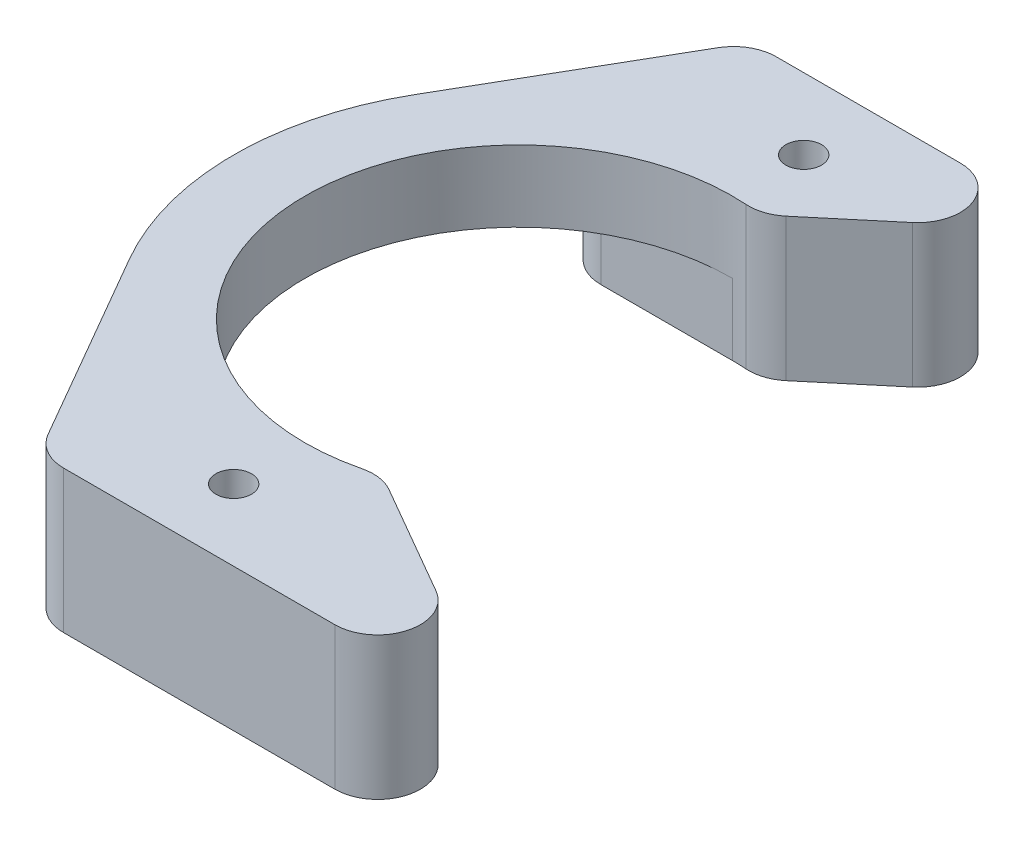
ISO-10303-21;
HEADER;
FILE_DESCRIPTION(('STEP AP214'),'2;1');
FILE_NAME('part.step','',(''),(''),'','','');
FILE_SCHEMA(('AUTOMOTIVE_DESIGN { 1 0 10303 214 1 1 1 1 }'));
ENDSEC;
DATA;
#1=APPLICATION_CONTEXT('core data for automotive mechanical design processes');
#2=APPLICATION_PROTOCOL_DEFINITION('international standard','automotive_design',2000,#1);
#3=PRODUCT_CONTEXT('',#1,'mechanical');
#4=PRODUCT('Part','Part','',(#3));
#5=PRODUCT_RELATED_PRODUCT_CATEGORY('part','',(#4));
#6=PRODUCT_DEFINITION_FORMATION('','',#4);
#7=PRODUCT_DEFINITION_CONTEXT('part definition',#1,'design');
#8=PRODUCT_DEFINITION('design','',#6,#7);
#9=PRODUCT_DEFINITION_SHAPE('','',#8);
#10=(LENGTH_UNIT() NAMED_UNIT(*) SI_UNIT(.MILLI.,.METRE.));
#11=(NAMED_UNIT(*) PLANE_ANGLE_UNIT() SI_UNIT($,.RADIAN.));
#12=(NAMED_UNIT(*) SI_UNIT($,.STERADIAN.) SOLID_ANGLE_UNIT());
#13=UNCERTAINTY_MEASURE_WITH_UNIT(LENGTH_MEASURE(1.E-05),#10,'distance_accuracy_value','');
#14=(GEOMETRIC_REPRESENTATION_CONTEXT(3) GLOBAL_UNCERTAINTY_ASSIGNED_CONTEXT((#13)) GLOBAL_UNIT_ASSIGNED_CONTEXT((#10,
#11,#12)) REPRESENTATION_CONTEXT('',''));
#15=CARTESIAN_POINT('',(0.,0.,0.));
#16=DIRECTION('',(0.,0.,1.));
#17=DIRECTION('',(1.,0.,0.));
#18=AXIS2_PLACEMENT_3D('',#15,#16,#17);
#19=CARTESIAN_POINT('',(-17.3205080756887,10.,-10.0000000000001));
#20=DIRECTION('',(0.866025403784436,0.,0.500000000000005));
#21=DIRECTION('',(0.500000000000005,0.,-0.866025403784436));
#22=AXIS2_PLACEMENT_3D('',#19,#20,#21);
#23=PLANE('',#22);
#24=DIRECTION('',(-0.500000000000005,0.,0.866025403784436));
#25=VECTOR('',#24,1.);
#26=CARTESIAN_POINT('',(-17.3205080756887,0.,-10.0000000000001));
#27=LINE('',#26,#25);
#28=CARTESIAN_POINT('',(-9.52627944162872,0.,-23.5));
#29=VERTEX_POINT('',#28);
#30=CARTESIAN_POINT('',(-11.8356805183873,0.,-19.5));
#31=VERTEX_POINT('',#30);
#32=EDGE_CURVE('E231',#29,#31,#27,.T.);
#33=ORIENTED_EDGE('',*,*,#32,.T.);
#34=DIRECTION('',(0.,-1.,0.));
#35=VECTOR('',#34,1.);
#36=CARTESIAN_POINT('',(-11.8356805183873,10.,-19.5));
#37=LINE('',#36,#35);
#38=CARTESIAN_POINT('',(-11.8356805183873,5.,-19.5));
#39=VERTEX_POINT('',#38);
#40=EDGE_CURVE('E290',#31,#39,#37,.F.);
#41=ORIENTED_EDGE('',*,*,#40,.T.);
#42=DIRECTION('',(0.500000000000004,0.,-0.866025403784436));
#43=VECTOR('',#42,1.);
#44=CARTESIAN_POINT('',(-14.4337567297406,5.,-15.));
#45=LINE('',#44,#43);
#46=CARTESIAN_POINT('',(-17.3205080756887,5.,-10.0000000000001));
#47=VERTEX_POINT('',#46);
#48=EDGE_CURVE('E216',#47,#39,#45,.T.);
#49=ORIENTED_EDGE('',*,*,#48,.F.);
#50=DIRECTION('',(0.,-1.,0.));
#51=VECTOR('',#50,1.);
#52=CARTESIAN_POINT('',(-17.3205080756887,10.,-10.0000000000001));
#53=LINE('',#52,#51);
#54=CARTESIAN_POINT('',(-17.3205080756887,10.,-10.0000000000001));
#55=VERTEX_POINT('',#54);
#56=EDGE_CURVE('E192',#55,#47,#53,.T.);
#57=ORIENTED_EDGE('',*,*,#56,.F.);
#58=DIRECTION('',(-0.500000000000005,0.,0.866025403784436));
#59=VECTOR('',#58,1.);
#60=CARTESIAN_POINT('',(-17.3205080756887,10.,-10.0000000000001));
#61=LINE('',#60,#59);
#62=CARTESIAN_POINT('',(-9.52627944162872,10.,-23.5));
#63=VERTEX_POINT('',#62);
#64=EDGE_CURVE('E235',#63,#55,#61,.T.);
#65=ORIENTED_EDGE('',*,*,#64,.F.);
#66=DIRECTION('',(0.,-1.,0.));
#67=VECTOR('',#66,1.);
#68=CARTESIAN_POINT('',(-9.52627944162873,10.,-23.5));
#69=LINE('',#68,#67);
#70=EDGE_CURVE('E284',#63,#29,#69,.T.);
#71=ORIENTED_EDGE('',*,*,#70,.T.);
#72=EDGE_LOOP('',(#33,#41,#49,#57,#65,#71));
#73=FACE_BOUND('',#72,.T.);
#74=ADVANCED_FACE('F43',(#73),#23,.F.);
#75=CARTESIAN_POINT('',(0.,10.,0.));
#76=DIRECTION('',(0.,-1.,0.));
#77=DIRECTION('',(0.,0.,-1.));
#78=AXIS2_PLACEMENT_3D('',#75,#76,#77);
#79=CYLINDRICAL_SURFACE('',#78,20.);
#80=CARTESIAN_POINT('',(0.,5.,0.));
#81=DIRECTION('',(0.,-1.,0.));
#82=DIRECTION('',(0.,0.,-1.));
#83=AXIS2_PLACEMENT_3D('',#80,#81,#82);
#84=CIRCLE('',#83,20.);
#85=CARTESIAN_POINT('',(-17.3205080756887,5.,10.0000000000001));
#86=VERTEX_POINT('',#85);
#87=EDGE_CURVE('E386',#86,#47,#84,.T.);
#88=ORIENTED_EDGE('',*,*,#87,.F.);
#89=DIRECTION('',(0.,-1.,0.));
#90=VECTOR('',#89,1.);
#91=CARTESIAN_POINT('',(-17.3205080756887,10.,10.0000000000001));
#92=LINE('',#91,#90);
#93=CARTESIAN_POINT('',(-17.3205080756887,10.,10.0000000000001));
#94=VERTEX_POINT('',#93);
#95=EDGE_CURVE('E252',#94,#86,#92,.T.);
#96=ORIENTED_EDGE('',*,*,#95,.F.);
#97=CARTESIAN_POINT('',(0.,10.,0.));
#98=DIRECTION('',(0.,1.,0.));
#99=DIRECTION('',(0.,0.,1.));
#100=AXIS2_PLACEMENT_3D('',#97,#98,#99);
#101=CIRCLE('',#100,20.);
#102=EDGE_CURVE('E232',#55,#94,#101,.T.);
#103=ORIENTED_EDGE('',*,*,#102,.F.);
#104=ORIENTED_EDGE('',*,*,#56,.T.);
#105=EDGE_LOOP('',(#88,#96,#103,#104));
#106=FACE_BOUND('',#105,.T.);
#107=ADVANCED_FACE('F396',(#106),#79,.T.);
#108=CARTESIAN_POINT('',(0.,10.,0.));
#109=DIRECTION('',(0.,-1.,0.));
#110=DIRECTION('',(0.,0.,-1.));
#111=AXIS2_PLACEMENT_3D('',#108,#109,#110);
#112=CYLINDRICAL_SURFACE('',#111,15.);
#113=CARTESIAN_POINT('',(0.,10.,0.));
#114=DIRECTION('',(0.,1.,0.));
#115=DIRECTION('',(0.,0.,1.));
#116=AXIS2_PLACEMENT_3D('',#113,#114,#115);
#117=CIRCLE('',#116,15.);
#118=CARTESIAN_POINT('',(0.98411456541952,10.,-14.9676824699794));
#119=VERTEX_POINT('',#118);
#120=CARTESIAN_POINT('',(3.56827443868658,10.,14.5694000401601));
#121=VERTEX_POINT('',#120);
#122=EDGE_CURVE('E246',#119,#121,#117,.T.);
#123=ORIENTED_EDGE('',*,*,#122,.T.);
#124=DIRECTION('',(0.,-1.,0.));
#125=VECTOR('',#124,1.);
#126=CARTESIAN_POINT('',(3.56827443868658,10.,14.5694000401601));
#127=LINE('',#126,#125);
#128=CARTESIAN_POINT('',(3.56827443868658,0.,14.5694000401601));
#129=VERTEX_POINT('',#128);
#130=EDGE_CURVE('E308',#121,#129,#127,.T.);
#131=ORIENTED_EDGE('',*,*,#130,.T.);
#132=CARTESIAN_POINT('',(0.,0.,0.));
#133=DIRECTION('',(0.,1.,0.));
#134=DIRECTION('',(0.,0.,1.));
#135=AXIS2_PLACEMENT_3D('',#132,#133,#134);
#136=CIRCLE('',#135,15.);
#137=CARTESIAN_POINT('',(0.,0.,15.));
#138=VERTEX_POINT('',#137);
#139=EDGE_CURVE('E211',#138,#129,#136,.T.);
#140=ORIENTED_EDGE('',*,*,#139,.F.);
#141=DIRECTION('',(0.,-1.,0.));
#142=VECTOR('',#141,1.);
#143=CARTESIAN_POINT('',(0.,5.,15.));
#144=LINE('',#143,#142);
#145=CARTESIAN_POINT('',(0.,5.,15.));
#146=VERTEX_POINT('',#145);
#147=EDGE_CURVE('E200',#146,#138,#144,.T.);
#148=ORIENTED_EDGE('',*,*,#147,.F.);
#149=CARTESIAN_POINT('',(0.,5.,0.));
#150=DIRECTION('',(0.,-1.,0.));
#151=DIRECTION('',(0.,0.,-1.));
#152=AXIS2_PLACEMENT_3D('',#149,#150,#151);
#153=CIRCLE('',#152,15.);
#154=CARTESIAN_POINT('',(0.,5.,-15.));
#155=VERTEX_POINT('',#154);
#156=EDGE_CURVE('E185',#146,#155,#153,.T.);
#157=ORIENTED_EDGE('',*,*,#156,.T.);
#158=DIRECTION('',(0.,-1.,0.));
#159=VECTOR('',#158,1.);
#160=CARTESIAN_POINT('',(1.57116660247941E-13,5.,-15.));
#161=LINE('',#160,#159);
#162=CARTESIAN_POINT('',(1.57116660247941E-13,0.,-15.));
#163=VERTEX_POINT('',#162);
#164=EDGE_CURVE('E215',#155,#163,#161,.T.);
#165=ORIENTED_EDGE('',*,*,#164,.T.);
#166=CARTESIAN_POINT('',(0.98411456541952,0.,-14.9676824699794));
#167=VERTEX_POINT('',#166);
#168=EDGE_CURVE('E262',#167,#163,#136,.T.);
#169=ORIENTED_EDGE('',*,*,#168,.F.);
#170=DIRECTION('',(0.,-1.,0.));
#171=VECTOR('',#170,1.);
#172=CARTESIAN_POINT('',(0.98411456541952,10.,-14.9676824699794));
#173=LINE('',#172,#171);
#174=EDGE_CURVE('E302',#167,#119,#173,.F.);
#175=ORIENTED_EDGE('',*,*,#174,.T.);
#176=EDGE_LOOP('',(#123,#131,#140,#148,#157,#165,#169,#175));
#177=FACE_BOUND('',#176,.T.);
#178=ADVANCED_FACE('F208',(#177),#112,.F.);
#179=CARTESIAN_POINT('',(0.,0.,0.));
#180=DIRECTION('',(0.,1.,0.));
#181=DIRECTION('',(0.,0.,1.));
#182=AXIS2_PLACEMENT_3D('',#179,#180,#181);
#183=PLANE('',#182);
#184=CARTESIAN_POINT('',(0.,0.,20.));
#185=DIRECTION('',(0.,-1.,0.));
#186=DIRECTION('',(0.,0.,-1.));
#187=AXIS2_PLACEMENT_3D('',#184,#185,#186);
#188=CIRCLE('',#187,1.25);
#189=CARTESIAN_POINT('',(0.,0.,18.75));
#190=VERTEX_POINT('',#189);
#191=EDGE_CURVE('E212',#190,#190,#188,.T.);
#192=ORIENTED_EDGE('',*,*,#191,.F.);
#193=EDGE_LOOP('',(#192));
#194=FACE_BOUND('',#193,.T.);
#195=DIRECTION('',(0.500000000000005,0.,0.866025403784436));
#196=VECTOR('',#195,1.);
#197=CARTESIAN_POINT('',(-17.3205080756887,0.,10.0000000000001));
#198=LINE('',#197,#196);
#199=CARTESIAN_POINT('',(-11.8356805183873,0.,19.5));
#200=VERTEX_POINT('',#199);
#201=CARTESIAN_POINT('',(-9.52627944162872,0.,23.5));
#202=VERTEX_POINT('',#201);
#203=EDGE_CURVE('E254',#200,#202,#198,.T.);
#204=ORIENTED_EDGE('',*,*,#203,.F.);
#205=CARTESIAN_POINT('',(-9.23760430703395,0.,18.));
#206=DIRECTION('',(0.,1.,0.));
#207=DIRECTION('',(0.,0.,1.));
#208=AXIS2_PLACEMENT_3D('',#205,#206,#207);
#209=CIRCLE('',#208,3.);
#210=CARTESIAN_POINT('',(-9.23760430703395,0.,15.));
#211=VERTEX_POINT('',#210);
#212=EDGE_CURVE('E301',#200,#211,#209,.F.);
#213=ORIENTED_EDGE('',*,*,#212,.T.);
#214=DIRECTION('',(-1.,0.,0.));
#215=VECTOR('',#214,1.);
#216=CARTESIAN_POINT('',(0.,0.,15.));
#217=LINE('',#216,#215);
#218=EDGE_CURVE('E384',#138,#211,#217,.T.);
#219=ORIENTED_EDGE('',*,*,#218,.F.);
#220=ORIENTED_EDGE('',*,*,#139,.T.);
#221=CARTESIAN_POINT('',(4.28192932642389,0.,17.4832800481921));
#222=DIRECTION('',(0.,1.,0.));
#223=DIRECTION('',(0.,0.,1.));
#224=AXIS2_PLACEMENT_3D('',#221,#222,#223);
#225=CIRCLE('',#224,3.);
#226=CARTESIAN_POINT('',(5.7819293264239,0.,14.8852038368388));
#227=VERTEX_POINT('',#226);
#228=EDGE_CURVE('E299',#129,#227,#225,.F.);
#229=ORIENTED_EDGE('',*,*,#228,.T.);
#230=DIRECTION('',(0.866025403784438,0.,0.500000000000001));
#231=VECTOR('',#230,1.);
#232=CARTESIAN_POINT('',(-5.00000000000001,0.,8.66025403784437));
#233=LINE('',#232,#231);
#234=CARTESIAN_POINT('',(13.6051177665153,0.,19.4019237886467));
#235=VERTEX_POINT('',#234);
#236=EDGE_CURVE('E261',#227,#235,#233,.T.);
#237=ORIENTED_EDGE('',*,*,#236,.T.);
#238=CARTESIAN_POINT('',(12.1051177665153,0.,22.));
#239=DIRECTION('',(0.,1.,0.));
#240=DIRECTION('',(0.,0.,1.));
#241=AXIS2_PLACEMENT_3D('',#238,#239,#240);
#242=CIRCLE('',#241,3.);
#243=CARTESIAN_POINT('',(12.1051177665153,0.,25.));
#244=VERTEX_POINT('',#243);
#245=EDGE_CURVE('E293',#235,#244,#242,.F.);
#246=ORIENTED_EDGE('',*,*,#245,.T.);
#247=DIRECTION('',(-1.,0.,0.));
#248=VECTOR('',#247,1.);
#249=CARTESIAN_POINT('',(0.,0.,25.));
#250=LINE('',#249,#248);
#251=CARTESIAN_POINT('',(-6.92820323027541,0.,25.));
#252=VERTEX_POINT('',#251);
#253=EDGE_CURVE('E256',#244,#252,#250,.T.);
#254=ORIENTED_EDGE('',*,*,#253,.T.);
#255=CARTESIAN_POINT('',(-6.92820323027541,0.,22.));
#256=DIRECTION('',(0.,1.,0.));
#257=DIRECTION('',(0.,0.,1.));
#258=AXIS2_PLACEMENT_3D('',#255,#256,#257);
#259=CIRCLE('',#258,3.);
#260=EDGE_CURVE('E300',#252,#202,#259,.F.);
#261=ORIENTED_EDGE('',*,*,#260,.T.);
#262=EDGE_LOOP('',(#204,#213,#219,#220,#229,#237,#246,#254,#261));
#263=FACE_BOUND('',#262,.T.);
#264=ADVANCED_FACE('F382',(#194,#263),#183,.F.);
#265=CARTESIAN_POINT('',(0.,0.,-20.));
#266=DIRECTION('',(0.,-1.,0.));
#267=DIRECTION('',(0.,0.,-1.));
#268=AXIS2_PLACEMENT_3D('',#265,#266,#267);
#269=CIRCLE('',#268,1.25);
#270=CARTESIAN_POINT('',(0.,0.,-21.25));
#271=VERTEX_POINT('',#270);
#272=EDGE_CURVE('E223',#271,#271,#269,.T.);
#273=ORIENTED_EDGE('',*,*,#272,.F.);
#274=EDGE_LOOP('',(#273));
#275=FACE_BOUND('',#274,.T.);
#276=DIRECTION('',(1.,0.,0.));
#277=VECTOR('',#276,1.);
#278=CARTESIAN_POINT('',(1.57116660247941E-13,0.,-15.));
#279=LINE('',#278,#277);
#280=CARTESIAN_POINT('',(-9.23760430703395,0.,-15.));
#281=VERTEX_POINT('',#280);
#282=EDGE_CURVE('E204',#281,#163,#279,.T.);
#283=ORIENTED_EDGE('',*,*,#282,.F.);
#284=CARTESIAN_POINT('',(-9.23760430703395,0.,-18.));
#285=DIRECTION('',(0.,1.,0.));
#286=DIRECTION('',(0.,0.,1.));
#287=AXIS2_PLACEMENT_3D('',#284,#285,#286);
#288=CIRCLE('',#287,3.);
#289=EDGE_CURVE('E285',#281,#31,#288,.F.);
#290=ORIENTED_EDGE('',*,*,#289,.T.);
#291=ORIENTED_EDGE('',*,*,#32,.F.);
#292=CARTESIAN_POINT('',(-6.92820323027542,0.,-22.));
#293=DIRECTION('',(0.,1.,0.));
#294=DIRECTION('',(0.,0.,1.));
#295=AXIS2_PLACEMENT_3D('',#292,#293,#294);
#296=CIRCLE('',#295,3.);
#297=CARTESIAN_POINT('',(-6.92820323027542,0.,-25.));
#298=VERTEX_POINT('',#297);
#299=EDGE_CURVE('E279',#29,#298,#296,.F.);
#300=ORIENTED_EDGE('',*,*,#299,.T.);
#301=DIRECTION('',(-1.,0.,0.));
#302=VECTOR('',#301,1.);
#303=CARTESIAN_POINT('',(0.,0.,-25.));
#304=LINE('',#303,#302);
#305=CARTESIAN_POINT('',(5.9941692878872,0.,-25.));
#306=VERTEX_POINT('',#305);
#307=EDGE_CURVE('E234',#306,#298,#304,.T.);
#308=ORIENTED_EDGE('',*,*,#307,.F.);
#309=CARTESIAN_POINT('',(5.9941692878872,0.,-22.));
#310=DIRECTION('',(0.,1.,0.));
#311=DIRECTION('',(0.,0.,1.));
#312=AXIS2_PLACEMENT_3D('',#309,#310,#311);
#313=CIRCLE('',#312,3.);
#314=CARTESIAN_POINT('',(7.92253211694682,0.,-19.7018666706431));
#315=VERTEX_POINT('',#314);
#316=EDGE_CURVE('E277',#306,#315,#313,.F.);
#317=ORIENTED_EDGE('',*,*,#316,.T.);
#318=DIRECTION('',(0.766044443118977,0.,-0.642787609686541));
#319=VECTOR('',#318,1.);
#320=CARTESIAN_POINT('',(-6.42787609686541,0.,-7.66044443118976));
#321=LINE('',#320,#319);
#322=CARTESIAN_POINT('',(3.10930030756305,0.,-15.6630856346184));
#323=VERTEX_POINT('',#322);
#324=EDGE_CURVE('E266',#323,#315,#321,.T.);
#325=ORIENTED_EDGE('',*,*,#324,.F.);
#326=CARTESIAN_POINT('',(1.18093747850342,0.,-17.9612189639753));
#327=DIRECTION('',(0.,1.,0.));
#328=DIRECTION('',(0.,0.,1.));
#329=AXIS2_PLACEMENT_3D('',#326,#327,#328);
#330=CIRCLE('',#329,3.);
#331=EDGE_CURVE('E278',#323,#167,#330,.F.);
#332=ORIENTED_EDGE('',*,*,#331,.T.);
#333=ORIENTED_EDGE('',*,*,#168,.T.);
#334=EDGE_LOOP('',(#283,#290,#291,#300,#308,#317,#325,#332,#333));
#335=FACE_BOUND('',#334,.T.);
#336=ADVANCED_FACE('F349',(#275,#335),#183,.F.);
#337=CARTESIAN_POINT('',(-17.3205080756887,10.,10.0000000000001));
#338=DIRECTION('',(0.866025403784436,0.,-0.500000000000005));
#339=DIRECTION('',(-0.500000000000005,0.,-0.866025403784436));
#340=AXIS2_PLACEMENT_3D('',#337,#338,#339);
#341=PLANE('',#340);
#342=DIRECTION('',(-0.500000000000004,0.,-0.866025403784436));
#343=VECTOR('',#342,1.);
#344=CARTESIAN_POINT('',(-14.4337567297406,5.,15.));
#345=LINE('',#344,#343);
#346=CARTESIAN_POINT('',(-11.8356805183873,5.,19.5));
#347=VERTEX_POINT('',#346);
#348=EDGE_CURVE('E201',#347,#86,#345,.T.);
#349=ORIENTED_EDGE('',*,*,#348,.F.);
#350=DIRECTION('',(0.,-1.,0.));
#351=VECTOR('',#350,1.);
#352=CARTESIAN_POINT('',(-11.8356805183873,10.,19.5));
#353=LINE('',#352,#351);
#354=EDGE_CURVE('E295',#347,#200,#353,.T.);
#355=ORIENTED_EDGE('',*,*,#354,.T.);
#356=ORIENTED_EDGE('',*,*,#203,.T.);
#357=DIRECTION('',(0.,-1.,0.));
#358=VECTOR('',#357,1.);
#359=CARTESIAN_POINT('',(-9.52627944162872,10.,23.5));
#360=LINE('',#359,#358);
#361=CARTESIAN_POINT('',(-9.52627944162872,10.,23.5));
#362=VERTEX_POINT('',#361);
#363=EDGE_CURVE('E289',#202,#362,#360,.F.);
#364=ORIENTED_EDGE('',*,*,#363,.T.);
#365=DIRECTION('',(0.500000000000005,0.,0.866025403784436));
#366=VECTOR('',#365,1.);
#367=CARTESIAN_POINT('',(-17.3205080756887,10.,10.0000000000001));
#368=LINE('',#367,#366);
#369=EDGE_CURVE('E240',#94,#362,#368,.T.);
#370=ORIENTED_EDGE('',*,*,#369,.F.);
#371=ORIENTED_EDGE('',*,*,#95,.T.);
#372=EDGE_LOOP('',(#349,#355,#356,#364,#370,#371));
#373=FACE_BOUND('',#372,.T.);
#374=ADVANCED_FACE('F397',(#373),#341,.F.);
#375=CARTESIAN_POINT('',(0.,10.,25.));
#376=DIRECTION('',(0.,0.,1.));
#377=DIRECTION('',(1.,0.,0.));
#378=AXIS2_PLACEMENT_3D('',#375,#376,#377);
#379=PLANE('',#378);
#380=DIRECTION('',(-1.,0.,0.));
#381=VECTOR('',#380,1.);
#382=CARTESIAN_POINT('',(0.,10.,25.));
#383=LINE('',#382,#381);
#384=CARTESIAN_POINT('',(12.1051177665153,10.,25.));
#385=VERTEX_POINT('',#384);
#386=CARTESIAN_POINT('',(-6.92820323027541,10.,25.));
#387=VERTEX_POINT('',#386);
#388=EDGE_CURVE('E238',#385,#387,#383,.T.);
#389=ORIENTED_EDGE('',*,*,#388,.T.);
#390=DIRECTION('',(0.,-1.,0.));
#391=VECTOR('',#390,1.);
#392=CARTESIAN_POINT('',(-6.92820323027541,0.,25.));
#393=LINE('',#392,#391);
#394=EDGE_CURVE('E332',#387,#252,#393,.T.);
#395=ORIENTED_EDGE('',*,*,#394,.T.);
#396=ORIENTED_EDGE('',*,*,#253,.F.);
#397=DIRECTION('',(0.,-1.,0.));
#398=VECTOR('',#397,1.);
#399=CARTESIAN_POINT('',(12.1051177665153,10.,25.));
#400=LINE('',#399,#398);
#401=EDGE_CURVE('E328',#244,#385,#400,.F.);
#402=ORIENTED_EDGE('',*,*,#401,.T.);
#403=EDGE_LOOP('',(#389,#395,#396,#402));
#404=FACE_BOUND('',#403,.T.);
#405=ADVANCED_FACE('F408',(#404),#379,.T.);
#406=CARTESIAN_POINT('',(-5.00000000000001,10.,8.66025403784437));
#407=DIRECTION('',(0.500000000000001,0.,-0.866025403784438));
#408=DIRECTION('',(-0.866025403784438,0.,-0.500000000000001));
#409=AXIS2_PLACEMENT_3D('',#406,#407,#408);
#410=PLANE('',#409);
#411=ORIENTED_EDGE('',*,*,#236,.F.);
#412=DIRECTION('',(0.,-1.,0.));
#413=VECTOR('',#412,1.);
#414=CARTESIAN_POINT('',(5.7819293264239,10.,14.8852038368388));
#415=LINE('',#414,#413);
#416=CARTESIAN_POINT('',(5.7819293264239,10.,14.8852038368388));
#417=VERTEX_POINT('',#416);
#418=EDGE_CURVE('E313',#227,#417,#415,.F.);
#419=ORIENTED_EDGE('',*,*,#418,.T.);
#420=DIRECTION('',(0.866025403784438,0.,0.500000000000001));
#421=VECTOR('',#420,1.);
#422=CARTESIAN_POINT('',(-5.00000000000001,10.,8.66025403784437));
#423=LINE('',#422,#421);
#424=CARTESIAN_POINT('',(13.6051177665153,10.,19.4019237886467));
#425=VERTEX_POINT('',#424);
#426=EDGE_CURVE('E243',#417,#425,#423,.T.);
#427=ORIENTED_EDGE('',*,*,#426,.T.);
#428=DIRECTION('',(0.,-1.,0.));
#429=VECTOR('',#428,1.);
#430=CARTESIAN_POINT('',(13.6051177665153,10.,19.4019237886467));
#431=LINE('',#430,#429);
#432=EDGE_CURVE('E306',#425,#235,#431,.T.);
#433=ORIENTED_EDGE('',*,*,#432,.T.);
#434=EDGE_LOOP('',(#411,#419,#427,#433));
#435=FACE_BOUND('',#434,.T.);
#436=ADVANCED_FACE('F412',(#435),#410,.T.);
#437=CARTESIAN_POINT('',(-6.42787609686541,10.,-7.66044443118976));
#438=DIRECTION('',(-0.642787609686541,0.,-0.766044443118977));
#439=DIRECTION('',(-0.766044443118977,0.,0.642787609686541));
#440=AXIS2_PLACEMENT_3D('',#437,#438,#439);
#441=PLANE('',#440);
#442=DIRECTION('',(0.766044443118977,0.,-0.642787609686541));
#443=VECTOR('',#442,1.);
#444=CARTESIAN_POINT('',(-6.42787609686541,10.,-7.66044443118976));
#445=LINE('',#444,#443);
#446=CARTESIAN_POINT('',(3.10930030756305,10.,-15.6630856346184));
#447=VERTEX_POINT('',#446);
#448=CARTESIAN_POINT('',(7.92253211694682,10.,-19.7018666706431));
#449=VERTEX_POINT('',#448);
#450=EDGE_CURVE('E248',#447,#449,#445,.T.);
#451=ORIENTED_EDGE('',*,*,#450,.F.);
#452=DIRECTION('',(0.,1.,0.));
#453=VECTOR('',#452,1.);
#454=CARTESIAN_POINT('',(3.10930030756305,0.,-15.6630856346184));
#455=LINE('',#454,#453);
#456=EDGE_CURVE('E326',#447,#323,#455,.F.);
#457=ORIENTED_EDGE('',*,*,#456,.T.);
#458=ORIENTED_EDGE('',*,*,#324,.T.);
#459=DIRECTION('',(0.,-1.,0.));
#460=VECTOR('',#459,1.);
#461=CARTESIAN_POINT('',(7.92253211694682,10.,-19.7018666706431));
#462=LINE('',#461,#460);
#463=EDGE_CURVE('E322',#315,#449,#462,.F.);
#464=ORIENTED_EDGE('',*,*,#463,.T.);
#465=EDGE_LOOP('',(#451,#457,#458,#464));
#466=FACE_BOUND('',#465,.T.);
#467=ADVANCED_FACE('F368',(#466),#441,.F.);
#468=CARTESIAN_POINT('',(0.,10.,-25.));
#469=DIRECTION('',(0.,0.,1.));
#470=DIRECTION('',(1.,0.,0.));
#471=AXIS2_PLACEMENT_3D('',#468,#469,#470);
#472=PLANE('',#471);
#473=ORIENTED_EDGE('',*,*,#307,.T.);
#474=DIRECTION('',(0.,-1.,0.));
#475=VECTOR('',#474,1.);
#476=CARTESIAN_POINT('',(-6.92820323027542,10.,-25.));
#477=LINE('',#476,#475);
#478=CARTESIAN_POINT('',(-6.92820323027542,10.,-25.));
#479=VERTEX_POINT('',#478);
#480=EDGE_CURVE('E59',#298,#479,#477,.F.);
#481=ORIENTED_EDGE('',*,*,#480,.T.);
#482=DIRECTION('',(-1.,0.,0.));
#483=VECTOR('',#482,1.);
#484=CARTESIAN_POINT('',(0.,10.,-25.));
#485=LINE('',#484,#483);
#486=CARTESIAN_POINT('',(5.9941692878872,10.,-25.));
#487=VERTEX_POINT('',#486);
#488=EDGE_CURVE('E249',#487,#479,#485,.T.);
#489=ORIENTED_EDGE('',*,*,#488,.F.);
#490=DIRECTION('',(0.,-1.,0.));
#491=VECTOR('',#490,1.);
#492=CARTESIAN_POINT('',(5.9941692878872,10.,-25.));
#493=LINE('',#492,#491);
#494=EDGE_CURVE('E331',#487,#306,#493,.T.);
#495=ORIENTED_EDGE('',*,*,#494,.T.);
#496=EDGE_LOOP('',(#473,#481,#489,#495));
#497=FACE_BOUND('',#496,.T.);
#498=ADVANCED_FACE('F358',(#497),#472,.F.);
#499=CARTESIAN_POINT('',(0.,10.,0.));
#500=DIRECTION('',(0.,1.,0.));
#501=DIRECTION('',(0.,0.,1.));
#502=AXIS2_PLACEMENT_3D('',#499,#500,#501);
#503=PLANE('',#502);
#504=CARTESIAN_POINT('',(0.,10.,20.));
#505=DIRECTION('',(0.,-1.,0.));
#506=DIRECTION('',(0.,0.,-1.));
#507=AXIS2_PLACEMENT_3D('',#504,#505,#506);
#508=CIRCLE('',#507,1.25);
#509=CARTESIAN_POINT('',(0.,10.,18.75));
#510=VERTEX_POINT('',#509);
#511=EDGE_CURVE('E225',#510,#510,#508,.T.);
#512=ORIENTED_EDGE('',*,*,#511,.T.);
#513=EDGE_LOOP('',(#512));
#514=FACE_BOUND('',#513,.T.);
#515=CARTESIAN_POINT('',(0.,10.,-20.));
#516=DIRECTION('',(0.,-1.,0.));
#517=DIRECTION('',(0.,0.,-1.));
#518=AXIS2_PLACEMENT_3D('',#515,#516,#517);
#519=CIRCLE('',#518,1.25);
#520=CARTESIAN_POINT('',(0.,10.,-21.25));
#521=VERTEX_POINT('',#520);
#522=EDGE_CURVE('E228',#521,#521,#519,.T.);
#523=ORIENTED_EDGE('',*,*,#522,.T.);
#524=EDGE_LOOP('',(#523));
#525=FACE_BOUND('',#524,.T.);
#526=ORIENTED_EDGE('',*,*,#426,.F.);
#527=CARTESIAN_POINT('',(4.28192932642389,10.,17.4832800481921));
#528=DIRECTION('',(0.,1.,0.));
#529=DIRECTION('',(0.,0.,1.));
#530=AXIS2_PLACEMENT_3D('',#527,#528,#529);
#531=CIRCLE('',#530,3.);
#532=EDGE_CURVE('E325',#417,#121,#531,.T.);
#533=ORIENTED_EDGE('',*,*,#532,.T.);
#534=ORIENTED_EDGE('',*,*,#122,.F.);
#535=CARTESIAN_POINT('',(1.18093747850342,10.,-17.9612189639753));
#536=DIRECTION('',(0.,1.,0.));
#537=DIRECTION('',(0.,0.,1.));
#538=AXIS2_PLACEMENT_3D('',#535,#536,#537);
#539=CIRCLE('',#538,3.);
#540=EDGE_CURVE('E319',#119,#447,#539,.T.);
#541=ORIENTED_EDGE('',*,*,#540,.T.);
#542=ORIENTED_EDGE('',*,*,#450,.T.);
#543=CARTESIAN_POINT('',(5.9941692878872,10.,-22.));
#544=DIRECTION('',(0.,1.,0.));
#545=DIRECTION('',(0.,0.,1.));
#546=AXIS2_PLACEMENT_3D('',#543,#544,#545);
#547=CIRCLE('',#546,3.);
#548=EDGE_CURVE('E61',#449,#487,#547,.T.);
#549=ORIENTED_EDGE('',*,*,#548,.T.);
#550=ORIENTED_EDGE('',*,*,#488,.T.);
#551=CARTESIAN_POINT('',(-6.92820323027542,10.,-22.));
#552=DIRECTION('',(0.,1.,0.));
#553=DIRECTION('',(0.,0.,1.));
#554=AXIS2_PLACEMENT_3D('',#551,#552,#553);
#555=CIRCLE('',#554,3.);
#556=EDGE_CURVE('E316',#479,#63,#555,.T.);
#557=ORIENTED_EDGE('',*,*,#556,.T.);
#558=ORIENTED_EDGE('',*,*,#64,.T.);
#559=ORIENTED_EDGE('',*,*,#102,.T.);
#560=ORIENTED_EDGE('',*,*,#369,.T.);
#561=CARTESIAN_POINT('',(-6.92820323027541,10.,22.));
#562=DIRECTION('',(0.,1.,0.));
#563=DIRECTION('',(0.,0.,1.));
#564=AXIS2_PLACEMENT_3D('',#561,#562,#563);
#565=CIRCLE('',#564,3.);
#566=EDGE_CURVE('E318',#362,#387,#565,.T.);
#567=ORIENTED_EDGE('',*,*,#566,.T.);
#568=ORIENTED_EDGE('',*,*,#388,.F.);
#569=CARTESIAN_POINT('',(12.1051177665153,10.,22.));
#570=DIRECTION('',(0.,1.,0.));
#571=DIRECTION('',(0.,0.,1.));
#572=AXIS2_PLACEMENT_3D('',#569,#570,#571);
#573=CIRCLE('',#572,3.);
#574=EDGE_CURVE('E311',#385,#425,#573,.T.);
#575=ORIENTED_EDGE('',*,*,#574,.T.);
#576=EDGE_LOOP('',(#526,#533,#534,#541,#542,#549,#550,#557,#558,#559,#560,#567,#568,#575));
#577=FACE_BOUND('',#576,.T.);
#578=ADVANCED_FACE('F376',(#514,#525,#577),#503,.T.);
#579=CARTESIAN_POINT('',(0.,0.,-20.));
#580=DIRECTION('',(0.,-1.,0.));
#581=DIRECTION('',(0.,0.,-1.));
#582=AXIS2_PLACEMENT_3D('',#579,#580,#581);
#583=CYLINDRICAL_SURFACE('',#582,1.25);
#584=ORIENTED_EDGE('',*,*,#522,.F.);
#585=EDGE_LOOP('',(#584));
#586=FACE_BOUND('',#585,.T.);
#587=ORIENTED_EDGE('',*,*,#272,.T.);
#588=EDGE_LOOP('',(#587));
#589=FACE_BOUND('',#588,.T.);
#590=ADVANCED_FACE('F562',(#586,#589),#583,.F.);
#591=CARTESIAN_POINT('',(0.,0.,20.));
#592=DIRECTION('',(0.,-1.,0.));
#593=DIRECTION('',(0.,0.,-1.));
#594=AXIS2_PLACEMENT_3D('',#591,#592,#593);
#595=CYLINDRICAL_SURFACE('',#594,1.25);
#596=ORIENTED_EDGE('',*,*,#511,.F.);
#597=EDGE_LOOP('',(#596));
#598=FACE_BOUND('',#597,.T.);
#599=ORIENTED_EDGE('',*,*,#191,.T.);
#600=EDGE_LOOP('',(#599));
#601=FACE_BOUND('',#600,.T.);
#602=ADVANCED_FACE('F518',(#598,#601),#595,.F.);
#603=CARTESIAN_POINT('',(1.57116660247941E-13,5.,-15.));
#604=DIRECTION('',(0.,0.,-1.));
#605=DIRECTION('',(-1.,0.,0.));
#606=AXIS2_PLACEMENT_3D('',#603,#604,#605);
#607=PLANE('',#606);
#608=DIRECTION('',(1.,0.,0.));
#609=VECTOR('',#608,1.);
#610=CARTESIAN_POINT('',(1.57116660247941E-13,5.,-15.));
#611=LINE('',#610,#609);
#612=CARTESIAN_POINT('',(-9.23760430703395,5.,-15.));
#613=VERTEX_POINT('',#612);
#614=EDGE_CURVE('E188',#613,#155,#611,.T.);
#615=ORIENTED_EDGE('',*,*,#614,.F.);
#616=DIRECTION('',(0.,-1.,0.));
#617=VECTOR('',#616,1.);
#618=CARTESIAN_POINT('',(-9.23760430703395,5.,-15.));
#619=LINE('',#618,#617);
#620=EDGE_CURVE('E193',#613,#281,#619,.T.);
#621=ORIENTED_EDGE('',*,*,#620,.T.);
#622=ORIENTED_EDGE('',*,*,#282,.T.);
#623=ORIENTED_EDGE('',*,*,#164,.F.);
#624=EDGE_LOOP('',(#615,#621,#622,#623));
#625=FACE_BOUND('',#624,.T.);
#626=ADVANCED_FACE('F343',(#625),#607,.F.);
#627=CARTESIAN_POINT('',(0.,5.,15.));
#628=DIRECTION('',(0.,0.,1.));
#629=DIRECTION('',(1.,0.,0.));
#630=AXIS2_PLACEMENT_3D('',#627,#628,#629);
#631=PLANE('',#630);
#632=ORIENTED_EDGE('',*,*,#218,.T.);
#633=DIRECTION('',(0.,-1.,0.));
#634=VECTOR('',#633,1.);
#635=CARTESIAN_POINT('',(-9.23760430703395,5.,15.));
#636=LINE('',#635,#634);
#637=CARTESIAN_POINT('',(-9.23760430703395,5.,15.));
#638=VERTEX_POINT('',#637);
#639=EDGE_CURVE('E205',#211,#638,#636,.F.);
#640=ORIENTED_EDGE('',*,*,#639,.T.);
#641=DIRECTION('',(-1.,0.,0.));
#642=VECTOR('',#641,1.);
#643=CARTESIAN_POINT('',(0.,5.,15.));
#644=LINE('',#643,#642);
#645=EDGE_CURVE('E183',#146,#638,#644,.T.);
#646=ORIENTED_EDGE('',*,*,#645,.F.);
#647=ORIENTED_EDGE('',*,*,#147,.T.);
#648=EDGE_LOOP('',(#632,#640,#646,#647));
#649=FACE_BOUND('',#648,.T.);
#650=ADVANCED_FACE('F196',(#649),#631,.F.);
#651=CARTESIAN_POINT('',(0.,5.,0.));
#652=DIRECTION('',(0.,-1.,0.));
#653=DIRECTION('',(0.,0.,-1.));
#654=AXIS2_PLACEMENT_3D('',#651,#652,#653);
#655=PLANE('',#654);
#656=ORIENTED_EDGE('',*,*,#645,.T.);
#657=CARTESIAN_POINT('',(-9.23760430703395,5.,18.));
#658=DIRECTION('',(0.,-1.,0.));
#659=DIRECTION('',(0.,0.,-1.));
#660=AXIS2_PLACEMENT_3D('',#657,#658,#659);
#661=CIRCLE('',#660,3.);
#662=EDGE_CURVE('E11',#638,#347,#661,.F.);
#663=ORIENTED_EDGE('',*,*,#662,.T.);
#664=ORIENTED_EDGE('',*,*,#348,.T.);
#665=ORIENTED_EDGE('',*,*,#87,.T.);
#666=ORIENTED_EDGE('',*,*,#48,.T.);
#667=CARTESIAN_POINT('',(-9.23760430703395,5.,-18.));
#668=DIRECTION('',(0.,-1.,0.));
#669=DIRECTION('',(0.,0.,-1.));
#670=AXIS2_PLACEMENT_3D('',#667,#668,#669);
#671=CIRCLE('',#670,3.);
#672=EDGE_CURVE('E51',#39,#613,#671,.F.);
#673=ORIENTED_EDGE('',*,*,#672,.T.);
#674=ORIENTED_EDGE('',*,*,#614,.T.);
#675=ORIENTED_EDGE('',*,*,#156,.F.);
#676=EDGE_LOOP('',(#656,#663,#664,#665,#666,#673,#674,#675));
#677=FACE_BOUND('',#676,.T.);
#678=ADVANCED_FACE('F184',(#677),#655,.T.);
#679=CARTESIAN_POINT('',(-9.23760430703395,5.,-18.));
#680=DIRECTION('',(0.,-1.,0.));
#681=DIRECTION('',(0.,0.,-1.));
#682=AXIS2_PLACEMENT_3D('',#679,#680,#681);
#683=CYLINDRICAL_SURFACE('',#682,3.);
#684=ORIENTED_EDGE('',*,*,#672,.F.);
#685=ORIENTED_EDGE('',*,*,#40,.F.);
#686=ORIENTED_EDGE('',*,*,#289,.F.);
#687=ORIENTED_EDGE('',*,*,#620,.F.);
#688=EDGE_LOOP('',(#684,#685,#686,#687));
#689=FACE_BOUND('',#688,.T.);
#690=ADVANCED_FACE('F347',(#689),#683,.T.);
#691=CARTESIAN_POINT('',(-9.23760430703395,10.,18.));
#692=DIRECTION('',(0.,-1.,0.));
#693=DIRECTION('',(0.,0.,-1.));
#694=AXIS2_PLACEMENT_3D('',#691,#692,#693);
#695=CYLINDRICAL_SURFACE('',#694,3.);
#696=ORIENTED_EDGE('',*,*,#662,.F.);
#697=ORIENTED_EDGE('',*,*,#639,.F.);
#698=ORIENTED_EDGE('',*,*,#212,.F.);
#699=ORIENTED_EDGE('',*,*,#354,.F.);
#700=EDGE_LOOP('',(#696,#697,#698,#699));
#701=FACE_BOUND('',#700,.T.);
#702=ADVANCED_FACE('F434',(#701),#695,.T.);
#703=CARTESIAN_POINT('',(4.28192932642389,10.,17.4832800481921));
#704=DIRECTION('',(0.,-1.,0.));
#705=DIRECTION('',(0.,0.,-1.));
#706=AXIS2_PLACEMENT_3D('',#703,#704,#705);
#707=CYLINDRICAL_SURFACE('',#706,3.);
#708=ORIENTED_EDGE('',*,*,#532,.F.);
#709=ORIENTED_EDGE('',*,*,#418,.F.);
#710=ORIENTED_EDGE('',*,*,#228,.F.);
#711=ORIENTED_EDGE('',*,*,#130,.F.);
#712=EDGE_LOOP('',(#708,#709,#710,#711));
#713=FACE_BOUND('',#712,.T.);
#714=ADVANCED_FACE('F379',(#713),#707,.T.);
#715=CARTESIAN_POINT('',(1.18093747850342,10.,-17.9612189639753));
#716=DIRECTION('',(0.,-1.,0.));
#717=DIRECTION('',(0.,0.,-1.));
#718=AXIS2_PLACEMENT_3D('',#715,#716,#717);
#719=CYLINDRICAL_SURFACE('',#718,3.);
#720=ORIENTED_EDGE('',*,*,#540,.F.);
#721=ORIENTED_EDGE('',*,*,#174,.F.);
#722=ORIENTED_EDGE('',*,*,#331,.F.);
#723=ORIENTED_EDGE('',*,*,#456,.F.);
#724=EDGE_LOOP('',(#720,#721,#722,#723));
#725=FACE_BOUND('',#724,.T.);
#726=ADVANCED_FACE('F367',(#725),#719,.T.);
#727=CARTESIAN_POINT('',(-6.92820323027541,10.,22.));
#728=DIRECTION('',(0.,1.,0.));
#729=DIRECTION('',(0.,0.,1.));
#730=AXIS2_PLACEMENT_3D('',#727,#728,#729);
#731=CYLINDRICAL_SURFACE('',#730,3.);
#732=ORIENTED_EDGE('',*,*,#566,.F.);
#733=ORIENTED_EDGE('',*,*,#363,.F.);
#734=ORIENTED_EDGE('',*,*,#260,.F.);
#735=ORIENTED_EDGE('',*,*,#394,.F.);
#736=EDGE_LOOP('',(#732,#733,#734,#735));
#737=FACE_BOUND('',#736,.T.);
#738=ADVANCED_FACE('F403',(#737),#731,.T.);
#739=CARTESIAN_POINT('',(-6.92820323027542,10.,-22.));
#740=DIRECTION('',(0.,-1.,0.));
#741=DIRECTION('',(0.,0.,-1.));
#742=AXIS2_PLACEMENT_3D('',#739,#740,#741);
#743=CYLINDRICAL_SURFACE('',#742,3.);
#744=ORIENTED_EDGE('',*,*,#556,.F.);
#745=ORIENTED_EDGE('',*,*,#480,.F.);
#746=ORIENTED_EDGE('',*,*,#299,.F.);
#747=ORIENTED_EDGE('',*,*,#70,.F.);
#748=EDGE_LOOP('',(#744,#745,#746,#747));
#749=FACE_BOUND('',#748,.T.);
#750=ADVANCED_FACE('F356',(#749),#743,.T.);
#751=CARTESIAN_POINT('',(5.9941692878872,10.,-22.));
#752=DIRECTION('',(0.,-1.,0.));
#753=DIRECTION('',(0.,0.,-1.));
#754=AXIS2_PLACEMENT_3D('',#751,#752,#753);
#755=CYLINDRICAL_SURFACE('',#754,3.);
#756=ORIENTED_EDGE('',*,*,#548,.F.);
#757=ORIENTED_EDGE('',*,*,#463,.F.);
#758=ORIENTED_EDGE('',*,*,#316,.F.);
#759=ORIENTED_EDGE('',*,*,#494,.F.);
#760=EDGE_LOOP('',(#756,#757,#758,#759));
#761=FACE_BOUND('',#760,.T.);
#762=ADVANCED_FACE('F363',(#761),#755,.T.);
#763=CARTESIAN_POINT('',(12.1051177665153,10.,22.));
#764=DIRECTION('',(0.,-1.,0.));
#765=DIRECTION('',(0.,0.,-1.));
#766=AXIS2_PLACEMENT_3D('',#763,#764,#765);
#767=CYLINDRICAL_SURFACE('',#766,3.);
#768=ORIENTED_EDGE('',*,*,#574,.F.);
#769=ORIENTED_EDGE('',*,*,#401,.F.);
#770=ORIENTED_EDGE('',*,*,#245,.F.);
#771=ORIENTED_EDGE('',*,*,#432,.F.);
#772=EDGE_LOOP('',(#768,#769,#770,#771));
#773=FACE_BOUND('',#772,.T.);
#774=ADVANCED_FACE('F44',(#773),#767,.T.);
#775=CLOSED_SHELL('',(#74,#107,#178,#264,#336,#374,#405,#436,#467,#498,#578,#590,#602,#626,#650,
#678,#690,#702,#714,#726,#738,#750,#762,#774));
#776=MANIFOLD_SOLID_BREP('B2',#775);
#777=ADVANCED_BREP_SHAPE_REPRESENTATION('',(#18,#776),#14);
#778=SHAPE_DEFINITION_REPRESENTATION(#9,#777);
ENDSEC;
END-ISO-10303-21;
